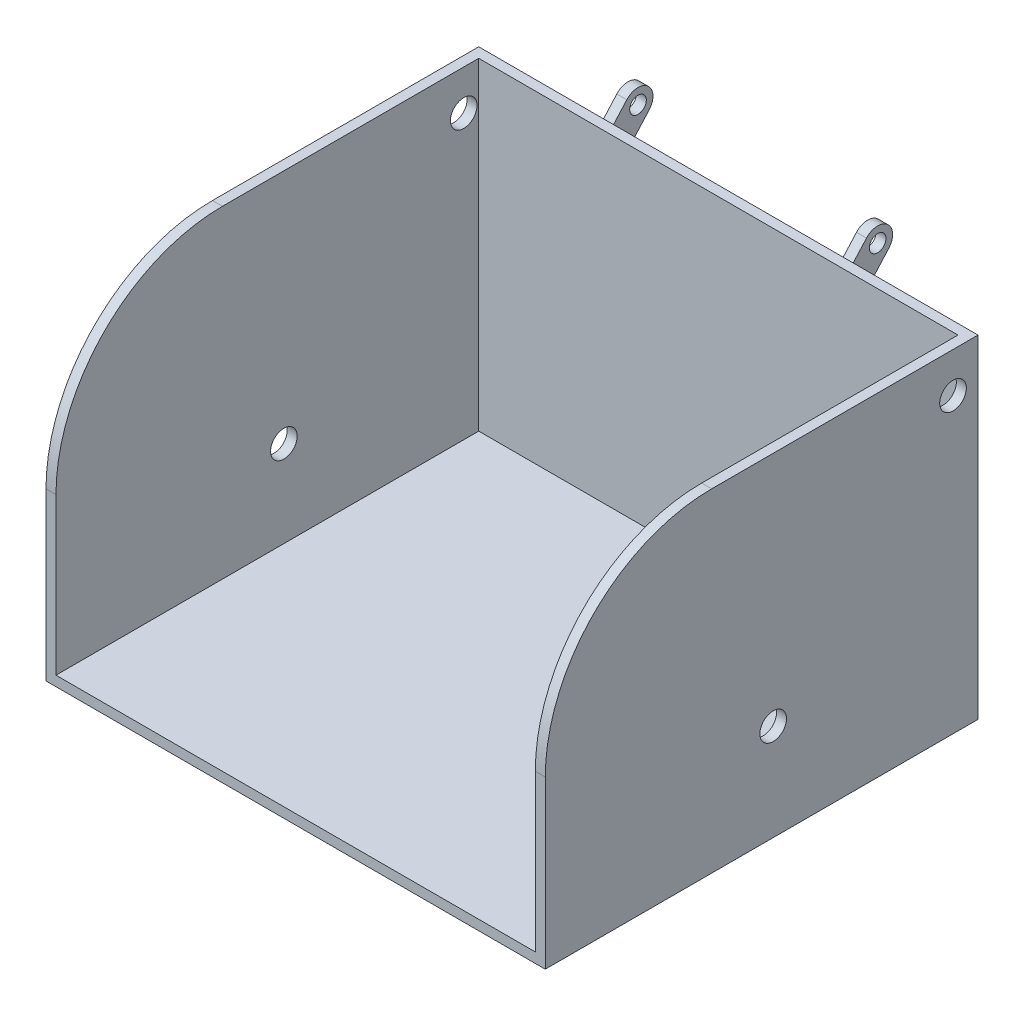
ISO-10303-21;
HEADER;
FILE_DESCRIPTION(('STEP AP214'),'2;1');
FILE_NAME('part.step','',(''),(''),'','','');
FILE_SCHEMA(('AUTOMOTIVE_DESIGN { 1 0 10303 214 1 1 1 1 }'));
ENDSEC;
DATA;
#1=APPLICATION_CONTEXT('core data for automotive mechanical design processes');
#2=APPLICATION_PROTOCOL_DEFINITION('international standard','automotive_design',2000,#1);
#3=PRODUCT_CONTEXT('',#1,'mechanical');
#4=PRODUCT('Part','Part','',(#3));
#5=PRODUCT_RELATED_PRODUCT_CATEGORY('part','',(#4));
#6=PRODUCT_DEFINITION_FORMATION('','',#4);
#7=PRODUCT_DEFINITION_CONTEXT('part definition',#1,'design');
#8=PRODUCT_DEFINITION('design','',#6,#7);
#9=PRODUCT_DEFINITION_SHAPE('','',#8);
#10=(LENGTH_UNIT() NAMED_UNIT(*) SI_UNIT(.MILLI.,.METRE.));
#11=(NAMED_UNIT(*) PLANE_ANGLE_UNIT() SI_UNIT($,.RADIAN.));
#12=(NAMED_UNIT(*) SI_UNIT($,.STERADIAN.) SOLID_ANGLE_UNIT());
#13=UNCERTAINTY_MEASURE_WITH_UNIT(LENGTH_MEASURE(1.E-05),#10,'distance_accuracy_value','');
#14=(GEOMETRIC_REPRESENTATION_CONTEXT(3) GLOBAL_UNCERTAINTY_ASSIGNED_CONTEXT((#13)) GLOBAL_UNIT_ASSIGNED_CONTEXT((#10,
#11,#12)) REPRESENTATION_CONTEXT('',''));
#15=CARTESIAN_POINT('',(0.,0.,0.));
#16=DIRECTION('',(0.,0.,1.));
#17=DIRECTION('',(1.,0.,0.));
#18=AXIS2_PLACEMENT_3D('',#15,#16,#17);
#19=CARTESIAN_POINT('',(150.,100.,0.));
#20=DIRECTION('',(0.,0.,-1.));
#21=DIRECTION('',(0.,1.,0.));
#22=AXIS2_PLACEMENT_3D('',#19,#20,#21);
#23=PLANE('',#22);
#24=DIRECTION('',(0.,-1.,0.));
#25=VECTOR('',#24,1.);
#26=CARTESIAN_POINT('',(40.5,100.,0.));
#27=LINE('',#26,#25);
#28=CARTESIAN_POINT('',(40.5,100.,0.));
#29=VERTEX_POINT('',#28);
#30=CARTESIAN_POINT('',(40.5,86.4836891794075,0.));
#31=VERTEX_POINT('',#30);
#32=EDGE_CURVE('E194',#29,#31,#27,.T.);
#33=ORIENTED_EDGE('',*,*,#32,.F.);
#34=DIRECTION('',(-1.,0.,0.));
#35=VECTOR('',#34,1.);
#36=CARTESIAN_POINT('',(150.,100.,0.));
#37=LINE('',#36,#35);
#38=CARTESIAN_POINT('',(109.5,100.,0.));
#39=VERTEX_POINT('',#38);
#40=EDGE_CURVE('E361',#39,#29,#37,.T.);
#41=ORIENTED_EDGE('',*,*,#40,.F.);
#42=DIRECTION('',(0.,-1.,0.));
#43=VECTOR('',#42,1.);
#44=CARTESIAN_POINT('',(109.5,100.,0.));
#45=LINE('',#44,#43);
#46=CARTESIAN_POINT('',(109.5,86.4836891794075,0.));
#47=VERTEX_POINT('',#46);
#48=EDGE_CURVE('E255',#39,#47,#45,.T.);
#49=ORIENTED_EDGE('',*,*,#48,.T.);
#50=DIRECTION('',(-1.,0.,0.));
#51=VECTOR('',#50,1.);
#52=CARTESIAN_POINT('',(112.5,86.4836891794075,0.));
#53=LINE('',#52,#51);
#54=CARTESIAN_POINT('',(112.5,86.4836891794075,0.));
#55=VERTEX_POINT('',#54);
#56=EDGE_CURVE('E267',#55,#47,#53,.T.);
#57=ORIENTED_EDGE('',*,*,#56,.F.);
#58=DIRECTION('',(0.,-1.,0.));
#59=VECTOR('',#58,1.);
#60=CARTESIAN_POINT('',(112.5,100.,0.));
#61=LINE('',#60,#59);
#62=CARTESIAN_POINT('',(112.5,100.,0.));
#63=VERTEX_POINT('',#62);
#64=EDGE_CURVE('E239',#63,#55,#61,.T.);
#65=ORIENTED_EDGE('',*,*,#64,.F.);
#66=CARTESIAN_POINT('',(150.,100.,0.));
#67=VERTEX_POINT('',#66);
#68=EDGE_CURVE('E358',#67,#63,#37,.T.);
#69=ORIENTED_EDGE('',*,*,#68,.F.);
#70=DIRECTION('',(0.,-1.,0.));
#71=VECTOR('',#70,1.);
#72=CARTESIAN_POINT('',(150.,100.,0.));
#73=LINE('',#72,#71);
#74=CARTESIAN_POINT('',(150.,0.,0.));
#75=VERTEX_POINT('',#74);
#76=EDGE_CURVE('E324',#67,#75,#73,.T.);
#77=ORIENTED_EDGE('',*,*,#76,.T.);
#78=DIRECTION('',(-1.,0.,0.));
#79=VECTOR('',#78,1.);
#80=CARTESIAN_POINT('',(150.,0.,0.));
#81=LINE('',#80,#79);
#82=CARTESIAN_POINT('',(0.,0.,0.));
#83=VERTEX_POINT('',#82);
#84=EDGE_CURVE('E356',#75,#83,#81,.T.);
#85=ORIENTED_EDGE('',*,*,#84,.T.);
#86=DIRECTION('',(0.,-1.,0.));
#87=VECTOR('',#86,1.);
#88=CARTESIAN_POINT('',(0.,100.,0.));
#89=LINE('',#88,#87);
#90=CARTESIAN_POINT('',(0.,100.,0.));
#91=VERTEX_POINT('',#90);
#92=EDGE_CURVE('E344',#91,#83,#89,.T.);
#93=ORIENTED_EDGE('',*,*,#92,.F.);
#94=CARTESIAN_POINT('',(37.5,100.,0.));
#95=VERTEX_POINT('',#94);
#96=EDGE_CURVE('E68',#95,#91,#37,.T.);
#97=ORIENTED_EDGE('',*,*,#96,.F.);
#98=DIRECTION('',(0.,-1.,0.));
#99=VECTOR('',#98,1.);
#100=CARTESIAN_POINT('',(37.5,100.,0.));
#101=LINE('',#100,#99);
#102=CARTESIAN_POINT('',(37.5,86.4836891794075,0.));
#103=VERTEX_POINT('',#102);
#104=EDGE_CURVE('E192',#95,#103,#101,.T.);
#105=ORIENTED_EDGE('',*,*,#104,.T.);
#106=DIRECTION('',(1.,0.,0.));
#107=VECTOR('',#106,1.);
#108=CARTESIAN_POINT('',(37.5,86.4836891794075,0.));
#109=LINE('',#108,#107);
#110=EDGE_CURVE('E65',#103,#31,#109,.T.);
#111=ORIENTED_EDGE('',*,*,#110,.T.);
#112=EDGE_LOOP('',(#33,#41,#49,#57,#65,#69,#77,#85,#93,#97,#105,#111));
#113=FACE_BOUND('',#112,.T.);
#114=ADVANCED_FACE('F50',(#113),#23,.T.);
#115=CARTESIAN_POINT('',(150.,50.,80.));
#116=DIRECTION('',(-1.,0.,0.));
#117=DIRECTION('',(0.,0.,1.));
#118=AXIS2_PLACEMENT_3D('',#115,#116,#117);
#119=CYLINDRICAL_SURFACE('',#118,50.);
#120=CARTESIAN_POINT('',(147.,50.,80.));
#121=DIRECTION('',(1.,0.,0.));
#122=DIRECTION('',(0.,0.,-1.));
#123=AXIS2_PLACEMENT_3D('',#120,#121,#122);
#124=CIRCLE('',#123,50.);
#125=CARTESIAN_POINT('',(147.,50.,130.));
#126=VERTEX_POINT('',#125);
#127=CARTESIAN_POINT('',(147.,100.,80.));
#128=VERTEX_POINT('',#127);
#129=EDGE_CURVE('E57',#126,#128,#124,.F.);
#130=ORIENTED_EDGE('',*,*,#129,.F.);
#131=DIRECTION('',(-1.,0.,0.));
#132=VECTOR('',#131,1.);
#133=CARTESIAN_POINT('',(150.,50.,130.));
#134=LINE('',#133,#132);
#135=CARTESIAN_POINT('',(150.,50.,130.));
#136=VERTEX_POINT('',#135);
#137=EDGE_CURVE('E369',#136,#126,#134,.T.);
#138=ORIENTED_EDGE('',*,*,#137,.F.);
#139=CARTESIAN_POINT('',(150.,50.,80.));
#140=DIRECTION('',(-1.,0.,0.));
#141=DIRECTION('',(0.,0.,1.));
#142=AXIS2_PLACEMENT_3D('',#139,#140,#141);
#143=CIRCLE('',#142,50.);
#144=CARTESIAN_POINT('',(150.,100.,80.));
#145=VERTEX_POINT('',#144);
#146=EDGE_CURVE('E316',#136,#145,#143,.T.);
#147=ORIENTED_EDGE('',*,*,#146,.T.);
#148=DIRECTION('',(-1.,0.,0.));
#149=VECTOR('',#148,1.);
#150=CARTESIAN_POINT('',(150.,100.,80.));
#151=LINE('',#150,#149);
#152=EDGE_CURVE('E365',#145,#128,#151,.T.);
#153=ORIENTED_EDGE('',*,*,#152,.T.);
#154=EDGE_LOOP('',(#130,#138,#147,#153));
#155=FACE_BOUND('',#154,.T.);
#156=ADVANCED_FACE('F389',(#155),#119,.T.);
#157=CARTESIAN_POINT('',(150.,0.,130.));
#158=DIRECTION('',(0.,0.,1.));
#159=DIRECTION('',(1.,0.,0.));
#160=AXIS2_PLACEMENT_3D('',#157,#158,#159);
#161=PLANE('',#160);
#162=DIRECTION('',(0.,1.,0.));
#163=VECTOR('',#162,1.);
#164=CARTESIAN_POINT('',(147.,0.,130.));
#165=LINE('',#164,#163);
#166=CARTESIAN_POINT('',(147.,2.99999999999999,130.));
#167=VERTEX_POINT('',#166);
#168=EDGE_CURVE('E306',#167,#126,#165,.T.);
#169=ORIENTED_EDGE('',*,*,#168,.F.);
#170=DIRECTION('',(1.,0.,0.));
#171=VECTOR('',#170,1.);
#172=CARTESIAN_POINT('',(150.,2.99999999999998,130.));
#173=LINE('',#172,#171);
#174=CARTESIAN_POINT('',(3.00000000000002,2.99999999999999,130.));
#175=VERTEX_POINT('',#174);
#176=EDGE_CURVE('E12',#175,#167,#173,.T.);
#177=ORIENTED_EDGE('',*,*,#176,.F.);
#178=DIRECTION('',(0.,-1.,0.));
#179=VECTOR('',#178,1.);
#180=CARTESIAN_POINT('',(3.00000000000003,0.,130.));
#181=LINE('',#180,#179);
#182=CARTESIAN_POINT('',(3.00000000000001,50.,130.));
#183=VERTEX_POINT('',#182);
#184=EDGE_CURVE('E295',#183,#175,#181,.T.);
#185=ORIENTED_EDGE('',*,*,#184,.F.);
#186=CARTESIAN_POINT('',(0.,50.,130.));
#187=VERTEX_POINT('',#186);
#188=EDGE_CURVE('E334',#183,#187,#134,.T.);
#189=ORIENTED_EDGE('',*,*,#188,.T.);
#190=DIRECTION('',(0.,1.,0.));
#191=VECTOR('',#190,1.);
#192=CARTESIAN_POINT('',(0.,0.,130.));
#193=LINE('',#192,#191);
#194=CARTESIAN_POINT('',(0.,0.,130.));
#195=VERTEX_POINT('',#194);
#196=EDGE_CURVE('E313',#195,#187,#193,.T.);
#197=ORIENTED_EDGE('',*,*,#196,.F.);
#198=DIRECTION('',(-1.,0.,0.));
#199=VECTOR('',#198,1.);
#200=CARTESIAN_POINT('',(150.,0.,130.));
#201=LINE('',#200,#199);
#202=CARTESIAN_POINT('',(150.,0.,130.));
#203=VERTEX_POINT('',#202);
#204=EDGE_CURVE('E351',#203,#195,#201,.T.);
#205=ORIENTED_EDGE('',*,*,#204,.F.);
#206=DIRECTION('',(0.,1.,0.));
#207=VECTOR('',#206,1.);
#208=CARTESIAN_POINT('',(150.,0.,130.));
#209=LINE('',#208,#207);
#210=EDGE_CURVE('E315',#203,#136,#209,.T.);
#211=ORIENTED_EDGE('',*,*,#210,.T.);
#212=ORIENTED_EDGE('',*,*,#137,.T.);
#213=EDGE_LOOP('',(#169,#177,#185,#189,#197,#205,#211,#212));
#214=FACE_BOUND('',#213,.T.);
#215=ADVANCED_FACE('F47',(#214),#161,.T.);
#216=CARTESIAN_POINT('',(150.,0.,0.));
#217=DIRECTION('',(0.,-1.,0.));
#218=DIRECTION('',(0.,0.,-1.));
#219=AXIS2_PLACEMENT_3D('',#216,#217,#218);
#220=PLANE('',#219);
#221=DIRECTION('',(0.,0.,1.));
#222=VECTOR('',#221,1.);
#223=CARTESIAN_POINT('',(0.,0.,0.));
#224=LINE('',#223,#222);
#225=EDGE_CURVE('E320',#83,#195,#224,.T.);
#226=ORIENTED_EDGE('',*,*,#225,.F.);
#227=ORIENTED_EDGE('',*,*,#84,.F.);
#228=DIRECTION('',(0.,0.,1.));
#229=VECTOR('',#228,1.);
#230=CARTESIAN_POINT('',(150.,0.,0.));
#231=LINE('',#230,#229);
#232=EDGE_CURVE('E328',#75,#203,#231,.T.);
#233=ORIENTED_EDGE('',*,*,#232,.T.);
#234=ORIENTED_EDGE('',*,*,#204,.T.);
#235=EDGE_LOOP('',(#226,#227,#233,#234));
#236=FACE_BOUND('',#235,.T.);
#237=ADVANCED_FACE('F398',(#236),#220,.T.);
#238=CARTESIAN_POINT('',(150.,100.,80.));
#239=DIRECTION('',(0.,1.,0.));
#240=DIRECTION('',(0.,0.,1.));
#241=AXIS2_PLACEMENT_3D('',#238,#239,#240);
#242=PLANE('',#241);
#243=DIRECTION('',(0.,0.,1.));
#244=VECTOR('',#243,1.);
#245=CARTESIAN_POINT('',(3.,100.,3.));
#246=LINE('',#245,#244);
#247=CARTESIAN_POINT('',(3.,100.,3.));
#248=VERTEX_POINT('',#247);
#249=CARTESIAN_POINT('',(3.,100.,80.));
#250=VERTEX_POINT('',#249);
#251=EDGE_CURVE('E280',#248,#250,#246,.T.);
#252=ORIENTED_EDGE('',*,*,#251,.F.);
#253=DIRECTION('',(-1.,0.,0.));
#254=VECTOR('',#253,1.);
#255=CARTESIAN_POINT('',(3.,100.,3.));
#256=LINE('',#255,#254);
#257=CARTESIAN_POINT('',(147.,100.,3.));
#258=VERTEX_POINT('',#257);
#259=EDGE_CURVE('E279',#258,#248,#256,.T.);
#260=ORIENTED_EDGE('',*,*,#259,.F.);
#261=DIRECTION('',(0.,0.,-1.));
#262=VECTOR('',#261,1.);
#263=CARTESIAN_POINT('',(147.,100.,3.));
#264=LINE('',#263,#262);
#265=EDGE_CURVE('E285',#128,#258,#264,.T.);
#266=ORIENTED_EDGE('',*,*,#265,.F.);
#267=ORIENTED_EDGE('',*,*,#152,.F.);
#268=DIRECTION('',(0.,0.,-1.));
#269=VECTOR('',#268,1.);
#270=CARTESIAN_POINT('',(150.,100.,80.));
#271=LINE('',#270,#269);
#272=EDGE_CURVE('E321',#145,#67,#271,.T.);
#273=ORIENTED_EDGE('',*,*,#272,.T.);
#274=ORIENTED_EDGE('',*,*,#68,.T.);
#275=DIRECTION('',(-1.,0.,0.));
#276=VECTOR('',#275,1.);
#277=CARTESIAN_POINT('',(112.5,100.,0.));
#278=LINE('',#277,#276);
#279=EDGE_CURVE('E272',#63,#39,#278,.T.);
#280=ORIENTED_EDGE('',*,*,#279,.T.);
#281=ORIENTED_EDGE('',*,*,#40,.T.);
#282=DIRECTION('',(1.,0.,0.));
#283=VECTOR('',#282,1.);
#284=CARTESIAN_POINT('',(37.5,100.,0.));
#285=LINE('',#284,#283);
#286=EDGE_CURVE('E210',#95,#29,#285,.T.);
#287=ORIENTED_EDGE('',*,*,#286,.F.);
#288=ORIENTED_EDGE('',*,*,#96,.T.);
#289=DIRECTION('',(0.,0.,-1.));
#290=VECTOR('',#289,1.);
#291=CARTESIAN_POINT('',(0.,100.,80.));
#292=LINE('',#291,#290);
#293=CARTESIAN_POINT('',(0.,100.,80.));
#294=VERTEX_POINT('',#293);
#295=EDGE_CURVE('E341',#294,#91,#292,.T.);
#296=ORIENTED_EDGE('',*,*,#295,.F.);
#297=EDGE_CURVE('E366',#250,#294,#151,.T.);
#298=ORIENTED_EDGE('',*,*,#297,.F.);
#299=EDGE_LOOP('',(#252,#260,#266,#267,#273,#274,#280,#281,#287,#288,#296,#298));
#300=FACE_BOUND('',#299,.T.);
#301=ADVANCED_FACE('F387',(#300),#242,.T.);
#302=CARTESIAN_POINT('',(3.,50.,80.));
#303=DIRECTION('',(-1.,0.,0.));
#304=DIRECTION('',(0.,0.,1.));
#305=AXIS2_PLACEMENT_3D('',#302,#303,#304);
#306=CIRCLE('',#305,50.);
#307=EDGE_CURVE('E352',#250,#183,#306,.F.);
#308=ORIENTED_EDGE('',*,*,#307,.F.);
#309=ORIENTED_EDGE('',*,*,#297,.T.);
#310=CARTESIAN_POINT('',(0.,50.,80.));
#311=DIRECTION('',(-1.,0.,0.));
#312=DIRECTION('',(0.,0.,1.));
#313=AXIS2_PLACEMENT_3D('',#310,#311,#312);
#314=CIRCLE('',#313,50.);
#315=EDGE_CURVE('E336',#187,#294,#314,.T.);
#316=ORIENTED_EDGE('',*,*,#315,.F.);
#317=ORIENTED_EDGE('',*,*,#188,.F.);
#318=EDGE_LOOP('',(#308,#309,#316,#317));
#319=FACE_BOUND('',#318,.T.);
#320=ADVANCED_FACE('F439',(#319),#119,.T.);
#321=CARTESIAN_POINT('',(150.,50.,80.));
#322=DIRECTION('',(-1.,0.,0.));
#323=DIRECTION('',(0.,0.,1.));
#324=AXIS2_PLACEMENT_3D('',#321,#322,#323);
#325=PLANE('',#324);
#326=CARTESIAN_POINT('',(150.,29.,61.5315164323));
#327=DIRECTION('',(1.,0.,0.));
#328=DIRECTION('',(0.,0.,-1.));
#329=AXIS2_PLACEMENT_3D('',#326,#327,#328);
#330=CIRCLE('',#329,4.00000000000001);
#331=CARTESIAN_POINT('',(150.,29.,57.5315164323));
#332=VERTEX_POINT('',#331);
#333=EDGE_CURVE('E555',#332,#332,#330,.T.);
#334=ORIENTED_EDGE('',*,*,#333,.F.);
#335=EDGE_LOOP('',(#334));
#336=FACE_BOUND('',#335,.T.);
#337=CARTESIAN_POINT('',(150.,88.,7.50374579533965));
#338=DIRECTION('',(1.,0.,0.));
#339=DIRECTION('',(0.,0.,-1.));
#340=AXIS2_PLACEMENT_3D('',#337,#338,#339);
#341=CIRCLE('',#340,4.);
#342=CARTESIAN_POINT('',(150.,88.,3.50374579533965));
#343=VERTEX_POINT('',#342);
#344=EDGE_CURVE('E543',#343,#343,#341,.T.);
#345=ORIENTED_EDGE('',*,*,#344,.F.);
#346=EDGE_LOOP('',(#345));
#347=FACE_BOUND('',#346,.T.);
#348=ORIENTED_EDGE('',*,*,#210,.F.);
#349=ORIENTED_EDGE('',*,*,#232,.F.);
#350=ORIENTED_EDGE('',*,*,#76,.F.);
#351=ORIENTED_EDGE('',*,*,#272,.F.);
#352=ORIENTED_EDGE('',*,*,#146,.F.);
#353=EDGE_LOOP('',(#348,#349,#350,#351,#352));
#354=FACE_BOUND('',#353,.T.);
#355=ADVANCED_FACE('F391',(#336,#347,#354),#325,.F.);
#356=CARTESIAN_POINT('',(0.,50.,80.));
#357=DIRECTION('',(-1.,0.,0.));
#358=DIRECTION('',(0.,0.,1.));
#359=AXIS2_PLACEMENT_3D('',#356,#357,#358);
#360=PLANE('',#359);
#361=CARTESIAN_POINT('',(0.,29.,61.5315164323001));
#362=DIRECTION('',(1.,0.,0.));
#363=DIRECTION('',(0.,0.,-1.));
#364=AXIS2_PLACEMENT_3D('',#361,#362,#363);
#365=CIRCLE('',#364,4.00000000000001);
#366=CARTESIAN_POINT('',(0.,29.,57.5315164323001));
#367=VERTEX_POINT('',#366);
#368=EDGE_CURVE('E534',#367,#367,#365,.T.);
#369=ORIENTED_EDGE('',*,*,#368,.T.);
#370=EDGE_LOOP('',(#369));
#371=FACE_BOUND('',#370,.T.);
#372=CARTESIAN_POINT('',(0.,88.,7.50374579533968));
#373=DIRECTION('',(1.,0.,0.));
#374=DIRECTION('',(0.,0.,-1.));
#375=AXIS2_PLACEMENT_3D('',#372,#373,#374);
#376=CIRCLE('',#375,4.);
#377=CARTESIAN_POINT('',(0.,88.,3.50374579533968));
#378=VERTEX_POINT('',#377);
#379=EDGE_CURVE('E537',#378,#378,#376,.T.);
#380=ORIENTED_EDGE('',*,*,#379,.T.);
#381=EDGE_LOOP('',(#380));
#382=FACE_BOUND('',#381,.T.);
#383=ORIENTED_EDGE('',*,*,#196,.T.);
#384=ORIENTED_EDGE('',*,*,#315,.T.);
#385=ORIENTED_EDGE('',*,*,#295,.T.);
#386=ORIENTED_EDGE('',*,*,#92,.T.);
#387=ORIENTED_EDGE('',*,*,#225,.T.);
#388=EDGE_LOOP('',(#383,#384,#385,#386,#387));
#389=FACE_BOUND('',#388,.T.);
#390=ADVANCED_FACE('F451',(#371,#382,#389),#360,.T.);
#391=CARTESIAN_POINT('',(150.,3.,0.));
#392=DIRECTION('',(0.,-1.,0.));
#393=DIRECTION('',(0.,0.,-1.));
#394=AXIS2_PLACEMENT_3D('',#391,#392,#393);
#395=PLANE('',#394);
#396=ORIENTED_EDGE('',*,*,#176,.T.);
#397=DIRECTION('',(0.,0.,-1.));
#398=VECTOR('',#397,1.);
#399=CARTESIAN_POINT('',(147.,3.,3.00000000000003));
#400=LINE('',#399,#398);
#401=CARTESIAN_POINT('',(147.,3.,3.));
#402=VERTEX_POINT('',#401);
#403=EDGE_CURVE('E281',#167,#402,#400,.T.);
#404=ORIENTED_EDGE('',*,*,#403,.T.);
#405=DIRECTION('',(-1.,0.,0.));
#406=VECTOR('',#405,1.);
#407=CARTESIAN_POINT('',(3.,3.,3.));
#408=LINE('',#407,#406);
#409=CARTESIAN_POINT('',(3.,3.,3.));
#410=VERTEX_POINT('',#409);
#411=EDGE_CURVE('E294',#402,#410,#408,.T.);
#412=ORIENTED_EDGE('',*,*,#411,.T.);
#413=DIRECTION('',(0.,0.,1.));
#414=VECTOR('',#413,1.);
#415=CARTESIAN_POINT('',(3.,3.,3.00000000000003));
#416=LINE('',#415,#414);
#417=EDGE_CURVE('E287',#410,#175,#416,.T.);
#418=ORIENTED_EDGE('',*,*,#417,.T.);
#419=EDGE_LOOP('',(#396,#404,#412,#418));
#420=FACE_BOUND('',#419,.T.);
#421=ADVANCED_FACE('F470',(#420),#395,.F.);
#422=CARTESIAN_POINT('',(147.,-195.345847153197,3.));
#423=DIRECTION('',(1.,0.,0.));
#424=DIRECTION('',(0.,0.,-1.));
#425=AXIS2_PLACEMENT_3D('',#422,#423,#424);
#426=PLANE('',#425);
#427=CARTESIAN_POINT('',(147.,29.,61.5315164323));
#428=DIRECTION('',(1.,0.,0.));
#429=DIRECTION('',(0.,0.,-1.));
#430=AXIS2_PLACEMENT_3D('',#427,#428,#429);
#431=CIRCLE('',#430,4.00000000000001);
#432=CARTESIAN_POINT('',(147.,29.,57.5315164323));
#433=VERTEX_POINT('',#432);
#434=EDGE_CURVE('E559',#433,#433,#431,.F.);
#435=ORIENTED_EDGE('',*,*,#434,.F.);
#436=EDGE_LOOP('',(#435));
#437=FACE_BOUND('',#436,.T.);
#438=CARTESIAN_POINT('',(147.,88.,7.50374579533965));
#439=DIRECTION('',(1.,0.,0.));
#440=DIRECTION('',(0.,0.,-1.));
#441=AXIS2_PLACEMENT_3D('',#438,#439,#440);
#442=CIRCLE('',#441,4.);
#443=CARTESIAN_POINT('',(147.,88.,3.50374579533965));
#444=VERTEX_POINT('',#443);
#445=EDGE_CURVE('E556',#444,#444,#442,.F.);
#446=ORIENTED_EDGE('',*,*,#445,.F.);
#447=EDGE_LOOP('',(#446));
#448=FACE_BOUND('',#447,.T.);
#449=ORIENTED_EDGE('',*,*,#168,.T.);
#450=ORIENTED_EDGE('',*,*,#129,.T.);
#451=ORIENTED_EDGE('',*,*,#265,.T.);
#452=DIRECTION('',(0.,1.,0.));
#453=VECTOR('',#452,1.);
#454=CARTESIAN_POINT('',(147.,-195.345847153197,3.));
#455=LINE('',#454,#453);
#456=EDGE_CURVE('E300',#402,#258,#455,.T.);
#457=ORIENTED_EDGE('',*,*,#456,.F.);
#458=ORIENTED_EDGE('',*,*,#403,.F.);
#459=EDGE_LOOP('',(#449,#450,#451,#457,#458));
#460=FACE_BOUND('',#459,.T.);
#461=ADVANCED_FACE('F378',(#437,#448,#460),#426,.F.);
#462=CARTESIAN_POINT('',(3.,-195.345847153197,3.));
#463=DIRECTION('',(0.,0.,-1.));
#464=DIRECTION('',(-1.,0.,0.));
#465=AXIS2_PLACEMENT_3D('',#462,#463,#464);
#466=PLANE('',#465);
#467=ORIENTED_EDGE('',*,*,#456,.T.);
#468=ORIENTED_EDGE('',*,*,#259,.T.);
#469=DIRECTION('',(0.,1.,0.));
#470=VECTOR('',#469,1.);
#471=CARTESIAN_POINT('',(3.,-195.345847153197,3.));
#472=LINE('',#471,#470);
#473=EDGE_CURVE('E291',#410,#248,#472,.T.);
#474=ORIENTED_EDGE('',*,*,#473,.F.);
#475=ORIENTED_EDGE('',*,*,#411,.F.);
#476=EDGE_LOOP('',(#467,#468,#474,#475));
#477=FACE_BOUND('',#476,.T.);
#478=ADVANCED_FACE('F477',(#477),#466,.F.);
#479=CARTESIAN_POINT('',(3.,-195.345847153197,3.));
#480=DIRECTION('',(-1.,0.,0.));
#481=DIRECTION('',(0.,0.,1.));
#482=AXIS2_PLACEMENT_3D('',#479,#480,#481);
#483=PLANE('',#482);
#484=CARTESIAN_POINT('',(3.,29.,61.5315164323001));
#485=DIRECTION('',(-1.,0.,0.));
#486=DIRECTION('',(0.,0.,1.));
#487=AXIS2_PLACEMENT_3D('',#484,#485,#486);
#488=CIRCLE('',#487,4.00000000000001);
#489=CARTESIAN_POINT('',(3.,29.,65.5315164323001));
#490=VERTEX_POINT('',#489);
#491=EDGE_CURVE('E540',#490,#490,#488,.T.);
#492=ORIENTED_EDGE('',*,*,#491,.T.);
#493=EDGE_LOOP('',(#492));
#494=FACE_BOUND('',#493,.T.);
#495=CARTESIAN_POINT('',(3.,88.,7.50374579533968));
#496=DIRECTION('',(-1.,0.,0.));
#497=DIRECTION('',(0.,0.,1.));
#498=AXIS2_PLACEMENT_3D('',#495,#496,#497);
#499=CIRCLE('',#498,4.);
#500=CARTESIAN_POINT('',(3.,88.,11.5037457953397));
#501=VERTEX_POINT('',#500);
#502=EDGE_CURVE('E546',#501,#501,#499,.T.);
#503=ORIENTED_EDGE('',*,*,#502,.T.);
#504=EDGE_LOOP('',(#503));
#505=FACE_BOUND('',#504,.T.);
#506=ORIENTED_EDGE('',*,*,#184,.T.);
#507=ORIENTED_EDGE('',*,*,#417,.F.);
#508=ORIENTED_EDGE('',*,*,#473,.T.);
#509=ORIENTED_EDGE('',*,*,#251,.T.);
#510=ORIENTED_EDGE('',*,*,#307,.T.);
#511=EDGE_LOOP('',(#506,#507,#508,#509,#510));
#512=FACE_BOUND('',#511,.T.);
#513=ADVANCED_FACE('F482',(#494,#505,#512),#483,.F.);
#514=CARTESIAN_POINT('',(112.5,101.480068926631,-7.35250950168863));
#515=DIRECTION('',(1.,0.,0.));
#516=DIRECTION('',(0.,0.,-1.));
#517=AXIS2_PLACEMENT_3D('',#514,#515,#516);
#518=PLANE('',#517);
#519=DIRECTION('',(0.,-0.746074778975722,0.665862166049647));
#520=VECTOR('',#519,1.);
#521=CARTESIAN_POINT('',(112.5,104.476448673854,-3.99517299629788));
#522=LINE('',#521,#520);
#523=CARTESIAN_POINT('',(112.5,104.476448673854,-3.99517299629788));
#524=VERTEX_POINT('',#523);
#525=EDGE_CURVE('E234',#524,#63,#522,.T.);
#526=ORIENTED_EDGE('',*,*,#525,.T.);
#527=ORIENTED_EDGE('',*,*,#64,.T.);
#528=DIRECTION('',(0.,0.746074778975722,-0.665862166049646));
#529=VECTOR('',#528,1.);
#530=CARTESIAN_POINT('',(112.5,86.4836891794075,0.));
#531=LINE('',#530,#529);
#532=CARTESIAN_POINT('',(112.5,98.4836891794075,-10.7098460070794));
#533=VERTEX_POINT('',#532);
#534=EDGE_CURVE('E243',#55,#533,#531,.T.);
#535=ORIENTED_EDGE('',*,*,#534,.T.);
#536=CARTESIAN_POINT('',(112.5,101.480068926631,-7.35250950168863));
#537=DIRECTION('',(1.,0.,0.));
#538=DIRECTION('',(0.,0.,-1.));
#539=AXIS2_PLACEMENT_3D('',#536,#537,#538);
#540=CIRCLE('',#539,4.5);
#541=EDGE_CURVE('E250',#533,#524,#540,.T.);
#542=ORIENTED_EDGE('',*,*,#541,.T.);
#543=EDGE_LOOP('',(#526,#527,#535,#542));
#544=FACE_BOUND('',#543,.T.);
#545=CARTESIAN_POINT('',(112.5,101.480068926631,-7.35250950168863));
#546=DIRECTION('',(1.,0.,0.));
#547=DIRECTION('',(0.,0.,-1.));
#548=AXIS2_PLACEMENT_3D('',#545,#546,#547);
#549=CIRCLE('',#548,2.5);
#550=CARTESIAN_POINT('',(112.5,101.480068926631,-9.85250950168863));
#551=VERTEX_POINT('',#550);
#552=EDGE_CURVE('E226',#551,#551,#549,.T.);
#553=ORIENTED_EDGE('',*,*,#552,.F.);
#554=EDGE_LOOP('',(#553));
#555=FACE_BOUND('',#554,.T.);
#556=ADVANCED_FACE('F403',(#544,#555),#518,.T.);
#557=CARTESIAN_POINT('',(109.5,101.480068926631,-7.35250950168863));
#558=DIRECTION('',(1.,0.,0.));
#559=DIRECTION('',(0.,0.,-1.));
#560=AXIS2_PLACEMENT_3D('',#557,#558,#559);
#561=PLANE('',#560);
#562=DIRECTION('',(0.,-0.746074778975722,0.665862166049647));
#563=VECTOR('',#562,1.);
#564=CARTESIAN_POINT('',(109.5,104.476448673854,-3.99517299629787));
#565=LINE('',#564,#563);
#566=CARTESIAN_POINT('',(109.5,104.476448673854,-3.99517299629788));
#567=VERTEX_POINT('',#566);
#568=EDGE_CURVE('E231',#567,#39,#565,.T.);
#569=ORIENTED_EDGE('',*,*,#568,.F.);
#570=CARTESIAN_POINT('',(109.5,101.480068926631,-7.35250950168863));
#571=DIRECTION('',(1.,0.,0.));
#572=DIRECTION('',(0.,0.,-1.));
#573=AXIS2_PLACEMENT_3D('',#570,#571,#572);
#574=CIRCLE('',#573,4.5);
#575=CARTESIAN_POINT('',(109.5,98.4836891794075,-10.7098460070794));
#576=VERTEX_POINT('',#575);
#577=EDGE_CURVE('E238',#576,#567,#574,.T.);
#578=ORIENTED_EDGE('',*,*,#577,.F.);
#579=DIRECTION('',(0.,0.746074778975722,-0.665862166049646));
#580=VECTOR('',#579,1.);
#581=CARTESIAN_POINT('',(109.5,86.4836891794075,0.));
#582=LINE('',#581,#580);
#583=EDGE_CURVE('E260',#47,#576,#582,.T.);
#584=ORIENTED_EDGE('',*,*,#583,.F.);
#585=ORIENTED_EDGE('',*,*,#48,.F.);
#586=EDGE_LOOP('',(#569,#578,#584,#585));
#587=FACE_BOUND('',#586,.T.);
#588=CARTESIAN_POINT('',(109.5,101.480068926631,-7.35250950168863));
#589=DIRECTION('',(1.,0.,0.));
#590=DIRECTION('',(0.,0.,-1.));
#591=AXIS2_PLACEMENT_3D('',#588,#589,#590);
#592=CIRCLE('',#591,2.5);
#593=CARTESIAN_POINT('',(109.5,101.480068926631,-9.85250950168863));
#594=VERTEX_POINT('',#593);
#595=EDGE_CURVE('E184',#594,#594,#592,.T.);
#596=ORIENTED_EDGE('',*,*,#595,.T.);
#597=EDGE_LOOP('',(#596));
#598=FACE_BOUND('',#597,.T.);
#599=ADVANCED_FACE('F414',(#587,#598),#561,.F.);
#600=CARTESIAN_POINT('',(112.5,104.476448673854,-3.99517299629788));
#601=DIRECTION('',(0.,-0.665862166049647,-0.746074778975722));
#602=DIRECTION('',(0.,0.746074778975722,-0.665862166049647));
#603=AXIS2_PLACEMENT_3D('',#600,#601,#602);
#604=PLANE('',#603);
#605=ORIENTED_EDGE('',*,*,#568,.T.);
#606=ORIENTED_EDGE('',*,*,#279,.F.);
#607=ORIENTED_EDGE('',*,*,#525,.F.);
#608=DIRECTION('',(-1.,0.,0.));
#609=VECTOR('',#608,1.);
#610=CARTESIAN_POINT('',(112.5,104.476448673854,-3.99517299629788));
#611=LINE('',#610,#609);
#612=EDGE_CURVE('E249',#524,#567,#611,.T.);
#613=ORIENTED_EDGE('',*,*,#612,.T.);
#614=EDGE_LOOP('',(#605,#606,#607,#613));
#615=FACE_BOUND('',#614,.T.);
#616=ADVANCED_FACE('F411',(#615),#604,.F.);
#617=CARTESIAN_POINT('',(112.5,86.4836891794075,0.));
#618=DIRECTION('',(0.,0.665862166049646,0.746074778975722));
#619=DIRECTION('',(0.,-0.746074778975722,0.665862166049646));
#620=AXIS2_PLACEMENT_3D('',#617,#618,#619);
#621=PLANE('',#620);
#622=ORIENTED_EDGE('',*,*,#583,.T.);
#623=DIRECTION('',(-1.,0.,0.));
#624=VECTOR('',#623,1.);
#625=CARTESIAN_POINT('',(112.5,98.4836891794075,-10.7098460070794));
#626=LINE('',#625,#624);
#627=EDGE_CURVE('E264',#533,#576,#626,.T.);
#628=ORIENTED_EDGE('',*,*,#627,.F.);
#629=ORIENTED_EDGE('',*,*,#534,.F.);
#630=ORIENTED_EDGE('',*,*,#56,.T.);
#631=EDGE_LOOP('',(#622,#628,#629,#630));
#632=FACE_BOUND('',#631,.T.);
#633=ADVANCED_FACE('F420',(#632),#621,.F.);
#634=CARTESIAN_POINT('',(112.5,101.480068926631,-7.35250950168863));
#635=DIRECTION('',(-1.,0.,0.));
#636=DIRECTION('',(0.,0.,1.));
#637=AXIS2_PLACEMENT_3D('',#634,#635,#636);
#638=CYLINDRICAL_SURFACE('',#637,4.5);
#639=ORIENTED_EDGE('',*,*,#577,.T.);
#640=ORIENTED_EDGE('',*,*,#612,.F.);
#641=ORIENTED_EDGE('',*,*,#541,.F.);
#642=ORIENTED_EDGE('',*,*,#627,.T.);
#643=EDGE_LOOP('',(#639,#640,#641,#642));
#644=FACE_BOUND('',#643,.T.);
#645=ADVANCED_FACE('F425',(#644),#638,.T.);
#646=CARTESIAN_POINT('',(112.5,101.480068926631,-7.35250950168863));
#647=DIRECTION('',(-1.,0.,0.));
#648=DIRECTION('',(0.,0.,1.));
#649=AXIS2_PLACEMENT_3D('',#646,#647,#648);
#650=CYLINDRICAL_SURFACE('',#649,2.5);
#651=ORIENTED_EDGE('',*,*,#552,.T.);
#652=EDGE_LOOP('',(#651));
#653=FACE_BOUND('',#652,.T.);
#654=ORIENTED_EDGE('',*,*,#595,.F.);
#655=EDGE_LOOP('',(#654));
#656=FACE_BOUND('',#655,.T.);
#657=ADVANCED_FACE('F424',(#653,#656),#650,.F.);
#658=CARTESIAN_POINT('',(37.5,104.476448673854,-3.99517299629786));
#659=DIRECTION('',(0.,0.665862166049647,0.746074778975722));
#660=DIRECTION('',(0.,-0.746074778975722,0.665862166049647));
#661=AXIS2_PLACEMENT_3D('',#658,#659,#660);
#662=PLANE('',#661);
#663=DIRECTION('',(0.,-0.746074778975722,0.665862166049647));
#664=VECTOR('',#663,1.);
#665=CARTESIAN_POINT('',(40.5,104.476448673854,-3.99517299629786));
#666=LINE('',#665,#664);
#667=CARTESIAN_POINT('',(40.5,104.476448673854,-3.99517299629786));
#668=VERTEX_POINT('',#667);
#669=EDGE_CURVE('E177',#668,#29,#666,.T.);
#670=ORIENTED_EDGE('',*,*,#669,.F.);
#671=DIRECTION('',(1.,0.,0.));
#672=VECTOR('',#671,1.);
#673=CARTESIAN_POINT('',(37.5,104.476448673854,-3.99517299629786));
#674=LINE('',#673,#672);
#675=CARTESIAN_POINT('',(37.5,104.476448673854,-3.99517299629786));
#676=VERTEX_POINT('',#675);
#677=EDGE_CURVE('E174',#676,#668,#674,.T.);
#678=ORIENTED_EDGE('',*,*,#677,.F.);
#679=DIRECTION('',(0.,-0.746074778975722,0.665862166049647));
#680=VECTOR('',#679,1.);
#681=CARTESIAN_POINT('',(37.5,104.476448673854,-3.99517299629786));
#682=LINE('',#681,#680);
#683=EDGE_CURVE('E172',#676,#95,#682,.T.);
#684=ORIENTED_EDGE('',*,*,#683,.T.);
#685=ORIENTED_EDGE('',*,*,#286,.T.);
#686=EDGE_LOOP('',(#670,#678,#684,#685));
#687=FACE_BOUND('',#686,.T.);
#688=ADVANCED_FACE('F175',(#687),#662,.T.);
#689=CARTESIAN_POINT('',(37.5,101.480068926631,-7.35250950168862));
#690=DIRECTION('',(1.,0.,0.));
#691=DIRECTION('',(0.,0.,-1.));
#692=AXIS2_PLACEMENT_3D('',#689,#690,#691);
#693=CYLINDRICAL_SURFACE('',#692,4.5);
#694=CARTESIAN_POINT('',(40.5,101.480068926631,-7.35250950168862));
#695=DIRECTION('',(1.,0.,0.));
#696=DIRECTION('',(0.,0.,-1.));
#697=AXIS2_PLACEMENT_3D('',#694,#695,#696);
#698=CIRCLE('',#697,4.5);
#699=CARTESIAN_POINT('',(40.5,98.4836891794075,-10.7098460070794));
#700=VERTEX_POINT('',#699);
#701=EDGE_CURVE('E209',#700,#668,#698,.T.);
#702=ORIENTED_EDGE('',*,*,#701,.F.);
#703=DIRECTION('',(1.,0.,0.));
#704=VECTOR('',#703,1.);
#705=CARTESIAN_POINT('',(37.5,98.4836891794075,-10.7098460070794));
#706=LINE('',#705,#704);
#707=CARTESIAN_POINT('',(37.5,98.4836891794075,-10.7098460070794));
#708=VERTEX_POINT('',#707);
#709=EDGE_CURVE('E183',#708,#700,#706,.T.);
#710=ORIENTED_EDGE('',*,*,#709,.F.);
#711=CARTESIAN_POINT('',(37.5,101.480068926631,-7.35250950168862));
#712=DIRECTION('',(1.,0.,0.));
#713=DIRECTION('',(0.,0.,-1.));
#714=AXIS2_PLACEMENT_3D('',#711,#712,#713);
#715=CIRCLE('',#714,4.5);
#716=EDGE_CURVE('E191',#708,#676,#715,.T.);
#717=ORIENTED_EDGE('',*,*,#716,.T.);
#718=ORIENTED_EDGE('',*,*,#677,.T.);
#719=EDGE_LOOP('',(#702,#710,#717,#718));
#720=FACE_BOUND('',#719,.T.);
#721=ADVANCED_FACE('F197',(#720),#693,.T.);
#722=CARTESIAN_POINT('',(37.5,86.4836891794075,0.));
#723=DIRECTION('',(0.,-0.665862166049646,-0.746074778975722));
#724=DIRECTION('',(0.,0.746074778975722,-0.665862166049646));
#725=AXIS2_PLACEMENT_3D('',#722,#723,#724);
#726=PLANE('',#725);
#727=DIRECTION('',(0.,0.746074778975722,-0.665862166049646));
#728=VECTOR('',#727,1.);
#729=CARTESIAN_POINT('',(40.5,86.4836891794075,0.));
#730=LINE('',#729,#728);
#731=EDGE_CURVE('E212',#31,#700,#730,.T.);
#732=ORIENTED_EDGE('',*,*,#731,.F.);
#733=ORIENTED_EDGE('',*,*,#110,.F.);
#734=DIRECTION('',(0.,0.746074778975722,-0.665862166049646));
#735=VECTOR('',#734,1.);
#736=CARTESIAN_POINT('',(37.5,86.4836891794075,0.));
#737=LINE('',#736,#735);
#738=EDGE_CURVE('E200',#103,#708,#737,.T.);
#739=ORIENTED_EDGE('',*,*,#738,.T.);
#740=ORIENTED_EDGE('',*,*,#709,.T.);
#741=EDGE_LOOP('',(#732,#733,#739,#740));
#742=FACE_BOUND('',#741,.T.);
#743=ADVANCED_FACE('F504',(#742),#726,.T.);
#744=CARTESIAN_POINT('',(37.5,101.480068926631,-7.35250950168862));
#745=DIRECTION('',(-1.,0.,0.));
#746=DIRECTION('',(0.,0.,-1.));
#747=AXIS2_PLACEMENT_3D('',#744,#745,#746);
#748=PLANE('',#747);
#749=CARTESIAN_POINT('',(37.5,101.480068926631,-7.35250950168862));
#750=DIRECTION('',(1.,0.,0.));
#751=DIRECTION('',(0.,0.,-1.));
#752=AXIS2_PLACEMENT_3D('',#749,#750,#751);
#753=CIRCLE('',#752,2.5);
#754=CARTESIAN_POINT('',(37.5,101.480068926631,-9.85250950168862));
#755=VERTEX_POINT('',#754);
#756=EDGE_CURVE('E211',#755,#755,#753,.T.);
#757=ORIENTED_EDGE('',*,*,#756,.T.);
#758=EDGE_LOOP('',(#757));
#759=FACE_BOUND('',#758,.T.);
#760=ORIENTED_EDGE('',*,*,#683,.F.);
#761=ORIENTED_EDGE('',*,*,#716,.F.);
#762=ORIENTED_EDGE('',*,*,#738,.F.);
#763=ORIENTED_EDGE('',*,*,#104,.F.);
#764=EDGE_LOOP('',(#760,#761,#762,#763));
#765=FACE_BOUND('',#764,.T.);
#766=ADVANCED_FACE('F188',(#759,#765),#748,.T.);
#767=CARTESIAN_POINT('',(40.5,101.480068926631,-7.35250950168862));
#768=DIRECTION('',(-1.,0.,0.));
#769=DIRECTION('',(0.,0.,-1.));
#770=AXIS2_PLACEMENT_3D('',#767,#768,#769);
#771=PLANE('',#770);
#772=CARTESIAN_POINT('',(40.5,101.480068926631,-7.35250950168862));
#773=DIRECTION('',(1.,0.,0.));
#774=DIRECTION('',(0.,0.,-1.));
#775=AXIS2_PLACEMENT_3D('',#772,#773,#774);
#776=CIRCLE('',#775,2.5);
#777=CARTESIAN_POINT('',(40.5,101.480068926631,-9.85250950168862));
#778=VERTEX_POINT('',#777);
#779=EDGE_CURVE('E561',#778,#778,#776,.T.);
#780=ORIENTED_EDGE('',*,*,#779,.F.);
#781=EDGE_LOOP('',(#780));
#782=FACE_BOUND('',#781,.T.);
#783=ORIENTED_EDGE('',*,*,#669,.T.);
#784=ORIENTED_EDGE('',*,*,#32,.T.);
#785=ORIENTED_EDGE('',*,*,#731,.T.);
#786=ORIENTED_EDGE('',*,*,#701,.T.);
#787=EDGE_LOOP('',(#783,#784,#785,#786));
#788=FACE_BOUND('',#787,.T.);
#789=ADVANCED_FACE('F502',(#782,#788),#771,.F.);
#790=CARTESIAN_POINT('',(37.5,101.480068926631,-7.35250950168862));
#791=DIRECTION('',(1.,0.,0.));
#792=DIRECTION('',(0.,0.,-1.));
#793=AXIS2_PLACEMENT_3D('',#790,#791,#792);
#794=CYLINDRICAL_SURFACE('',#793,2.5);
#795=ORIENTED_EDGE('',*,*,#756,.F.);
#796=EDGE_LOOP('',(#795));
#797=FACE_BOUND('',#796,.T.);
#798=ORIENTED_EDGE('',*,*,#779,.T.);
#799=EDGE_LOOP('',(#798));
#800=FACE_BOUND('',#799,.T.);
#801=ADVANCED_FACE('F507',(#797,#800),#794,.F.);
#802=CARTESIAN_POINT('',(-0.001000000000001,88.,7.50374579533965));
#803=DIRECTION('',(1.,0.,0.));
#804=DIRECTION('',(0.,0.,-1.));
#805=AXIS2_PLACEMENT_3D('',#802,#803,#804);
#806=CYLINDRICAL_SURFACE('',#805,4.);
#807=ORIENTED_EDGE('',*,*,#344,.T.);
#808=EDGE_LOOP('',(#807));
#809=FACE_BOUND('',#808,.T.);
#810=ORIENTED_EDGE('',*,*,#445,.T.);
#811=EDGE_LOOP('',(#810));
#812=FACE_BOUND('',#811,.T.);
#813=ADVANCED_FACE('F513',(#809,#812),#806,.F.);
#814=CARTESIAN_POINT('',(-0.001000000000001,29.,61.5315164323));
#815=DIRECTION('',(1.,0.,0.));
#816=DIRECTION('',(0.,0.,-1.));
#817=AXIS2_PLACEMENT_3D('',#814,#815,#816);
#818=CYLINDRICAL_SURFACE('',#817,4.00000000000001);
#819=ORIENTED_EDGE('',*,*,#333,.T.);
#820=EDGE_LOOP('',(#819));
#821=FACE_BOUND('',#820,.T.);
#822=ORIENTED_EDGE('',*,*,#434,.T.);
#823=EDGE_LOOP('',(#822));
#824=FACE_BOUND('',#823,.T.);
#825=ADVANCED_FACE('F518',(#821,#824),#818,.F.);
#826=CARTESIAN_POINT('',(150.001,88.,7.50374579533963));
#827=DIRECTION('',(-1.,0.,0.));
#828=DIRECTION('',(0.,0.,1.));
#829=AXIS2_PLACEMENT_3D('',#826,#827,#828);
#830=CYLINDRICAL_SURFACE('',#829,4.);
#831=ORIENTED_EDGE('',*,*,#379,.F.);
#832=EDGE_LOOP('',(#831));
#833=FACE_BOUND('',#832,.T.);
#834=ORIENTED_EDGE('',*,*,#502,.F.);
#835=EDGE_LOOP('',(#834));
#836=FACE_BOUND('',#835,.T.);
#837=ADVANCED_FACE('F525',(#833,#836),#830,.F.);
#838=CARTESIAN_POINT('',(150.001,29.,61.5315164323));
#839=DIRECTION('',(-1.,0.,0.));
#840=DIRECTION('',(0.,0.,1.));
#841=AXIS2_PLACEMENT_3D('',#838,#839,#840);
#842=CYLINDRICAL_SURFACE('',#841,4.00000000000001);
#843=ORIENTED_EDGE('',*,*,#368,.F.);
#844=EDGE_LOOP('',(#843));
#845=FACE_BOUND('',#844,.T.);
#846=ORIENTED_EDGE('',*,*,#491,.F.);
#847=EDGE_LOOP('',(#846));
#848=FACE_BOUND('',#847,.T.);
#849=ADVANCED_FACE('F528',(#845,#848),#842,.F.);
#850=CLOSED_SHELL('',(#114,#156,#215,#237,#301,#320,#355,#390,#421,#461,#478,#513,#556,#599,
#616,#633,#645,#657,#688,#721,#743,#766,#789,#801,#813,#825,#837,#849));
#851=MANIFOLD_SOLID_BREP('B2',#850);
#852=ADVANCED_BREP_SHAPE_REPRESENTATION('',(#18,#851),#14);
#853=SHAPE_DEFINITION_REPRESENTATION(#9,#852);
ENDSEC;
END-ISO-10303-21;
